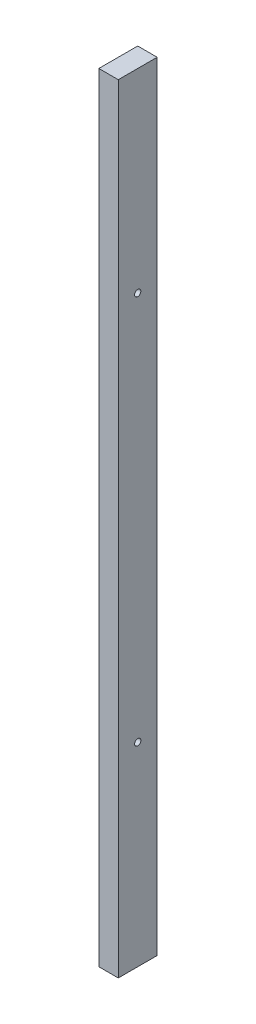
ISO-10303-21;
HEADER;
FILE_DESCRIPTION(('STEP AP214'),'2;1');
FILE_NAME('part.step','',(''),(''),'','','');
FILE_SCHEMA(('AUTOMOTIVE_DESIGN { 1 0 10303 214 1 1 1 1 }'));
ENDSEC;
DATA;
#1=APPLICATION_CONTEXT('core data for automotive mechanical design processes');
#2=APPLICATION_PROTOCOL_DEFINITION('international standard','automotive_design',2000,#1);
#3=PRODUCT_CONTEXT('',#1,'mechanical');
#4=PRODUCT('Part','Part','',(#3));
#5=PRODUCT_RELATED_PRODUCT_CATEGORY('part','',(#4));
#6=PRODUCT_DEFINITION_FORMATION('','',#4);
#7=PRODUCT_DEFINITION_CONTEXT('part definition',#1,'design');
#8=PRODUCT_DEFINITION('design','',#6,#7);
#9=PRODUCT_DEFINITION_SHAPE('','',#8);
#10=(LENGTH_UNIT() NAMED_UNIT(*) SI_UNIT(.MILLI.,.METRE.));
#11=(NAMED_UNIT(*) PLANE_ANGLE_UNIT() SI_UNIT($,.RADIAN.));
#12=(NAMED_UNIT(*) SI_UNIT($,.STERADIAN.) SOLID_ANGLE_UNIT());
#13=UNCERTAINTY_MEASURE_WITH_UNIT(LENGTH_MEASURE(1.E-05),#10,'distance_accuracy_value','');
#14=(GEOMETRIC_REPRESENTATION_CONTEXT(3) GLOBAL_UNCERTAINTY_ASSIGNED_CONTEXT((#13)) GLOBAL_UNIT_ASSIGNED_CONTEXT((#10,
#11,#12)) REPRESENTATION_CONTEXT('',''));
#15=CARTESIAN_POINT('',(0.,0.,0.));
#16=DIRECTION('',(0.,0.,1.));
#17=DIRECTION('',(1.,0.,0.));
#18=AXIS2_PLACEMENT_3D('',#15,#16,#17);
#19=CARTESIAN_POINT('',(-12.5,1000.,-25.));
#20=DIRECTION('',(1.,0.,0.));
#21=DIRECTION('',(0.,0.,-1.));
#22=AXIS2_PLACEMENT_3D('',#19,#20,#21);
#23=PLANE('',#22);
#24=CARTESIAN_POINT('',(-12.5000000000002,250.,0.));
#25=DIRECTION('',(1.,0.,0.));
#26=DIRECTION('',(0.,0.,-1.));
#27=AXIS2_PLACEMENT_3D('',#24,#25,#26);
#28=CIRCLE('',#27,4.);
#29=CARTESIAN_POINT('',(-12.5000000000002,250.,-4.));
#30=VERTEX_POINT('',#29);
#31=EDGE_CURVE('E114',#30,#30,#28,.T.);
#32=ORIENTED_EDGE('',*,*,#31,.T.);
#33=EDGE_LOOP('',(#32));
#34=FACE_BOUND('',#33,.T.);
#35=CARTESIAN_POINT('',(-12.5000000000002,750.,0.));
#36=DIRECTION('',(1.,0.,0.));
#37=DIRECTION('',(0.,0.,-1.));
#38=AXIS2_PLACEMENT_3D('',#35,#36,#37);
#39=CIRCLE('',#38,4.);
#40=CARTESIAN_POINT('',(-12.5000000000002,750.,-4.));
#41=VERTEX_POINT('',#40);
#42=EDGE_CURVE('E134',#41,#41,#39,.T.);
#43=ORIENTED_EDGE('',*,*,#42,.T.);
#44=EDGE_LOOP('',(#43));
#45=FACE_BOUND('',#44,.T.);
#46=DIRECTION('',(0.,0.,1.));
#47=VECTOR('',#46,1.);
#48=CARTESIAN_POINT('',(-12.5,0.,-25.));
#49=LINE('',#48,#47);
#50=CARTESIAN_POINT('',(-12.5,0.,-25.));
#51=VERTEX_POINT('',#50);
#52=CARTESIAN_POINT('',(-12.5,0.,25.));
#53=VERTEX_POINT('',#52);
#54=EDGE_CURVE('E110',#51,#53,#49,.T.);
#55=ORIENTED_EDGE('',*,*,#54,.T.);
#56=DIRECTION('',(0.,-1.,0.));
#57=VECTOR('',#56,1.);
#58=CARTESIAN_POINT('',(-12.5,1000.,25.));
#59=LINE('',#58,#57);
#60=CARTESIAN_POINT('',(-12.5,1000.,25.));
#61=VERTEX_POINT('',#60);
#62=EDGE_CURVE('E11',#61,#53,#59,.T.);
#63=ORIENTED_EDGE('',*,*,#62,.F.);
#64=DIRECTION('',(0.,0.,1.));
#65=VECTOR('',#64,1.);
#66=CARTESIAN_POINT('',(-12.5,1000.,-25.));
#67=LINE('',#66,#65);
#68=CARTESIAN_POINT('',(-12.5,1000.,-25.));
#69=VERTEX_POINT('',#68);
#70=EDGE_CURVE('E94',#69,#61,#67,.T.);
#71=ORIENTED_EDGE('',*,*,#70,.F.);
#72=DIRECTION('',(0.,-1.,0.));
#73=VECTOR('',#72,1.);
#74=CARTESIAN_POINT('',(-12.5,1000.,-25.));
#75=LINE('',#74,#73);
#76=EDGE_CURVE('E106',#69,#51,#75,.T.);
#77=ORIENTED_EDGE('',*,*,#76,.T.);
#78=EDGE_LOOP('',(#55,#63,#71,#77));
#79=FACE_BOUND('',#78,.T.);
#80=ADVANCED_FACE('F42',(#34,#45,#79),#23,.F.);
#81=CARTESIAN_POINT('',(12.5,1000.,25.));
#82=DIRECTION('',(0.,0.,-1.));
#83=DIRECTION('',(-1.,0.,0.));
#84=AXIS2_PLACEMENT_3D('',#81,#82,#83);
#85=PLANE('',#84);
#86=DIRECTION('',(1.,0.,0.));
#87=VECTOR('',#86,1.);
#88=CARTESIAN_POINT('',(12.5,0.,25.));
#89=LINE('',#88,#87);
#90=CARTESIAN_POINT('',(12.5,0.,25.));
#91=VERTEX_POINT('',#90);
#92=EDGE_CURVE('E99',#53,#91,#89,.T.);
#93=ORIENTED_EDGE('',*,*,#92,.T.);
#94=DIRECTION('',(0.,-1.,0.));
#95=VECTOR('',#94,1.);
#96=CARTESIAN_POINT('',(12.5,1000.,25.));
#97=LINE('',#96,#95);
#98=CARTESIAN_POINT('',(12.5,1000.,25.));
#99=VERTEX_POINT('',#98);
#100=EDGE_CURVE('E51',#99,#91,#97,.T.);
#101=ORIENTED_EDGE('',*,*,#100,.F.);
#102=DIRECTION('',(1.,0.,0.));
#103=VECTOR('',#102,1.);
#104=CARTESIAN_POINT('',(12.5,1000.,25.));
#105=LINE('',#104,#103);
#106=EDGE_CURVE('E89',#61,#99,#105,.T.);
#107=ORIENTED_EDGE('',*,*,#106,.F.);
#108=ORIENTED_EDGE('',*,*,#62,.T.);
#109=EDGE_LOOP('',(#93,#101,#107,#108));
#110=FACE_BOUND('',#109,.T.);
#111=ADVANCED_FACE('F98',(#110),#85,.F.);
#112=CARTESIAN_POINT('',(12.5,1000.,-25.));
#113=DIRECTION('',(-1.,0.,0.));
#114=DIRECTION('',(0.,0.,1.));
#115=AXIS2_PLACEMENT_3D('',#112,#113,#114);
#116=PLANE('',#115);
#117=CARTESIAN_POINT('',(12.5,250.,0.));
#118=DIRECTION('',(1.,0.,0.));
#119=DIRECTION('',(0.,0.,-1.));
#120=AXIS2_PLACEMENT_3D('',#117,#118,#119);
#121=CIRCLE('',#120,4.);
#122=CARTESIAN_POINT('',(12.5,250.,-4.));
#123=VERTEX_POINT('',#122);
#124=EDGE_CURVE('E138',#123,#123,#121,.T.);
#125=ORIENTED_EDGE('',*,*,#124,.F.);
#126=EDGE_LOOP('',(#125));
#127=FACE_BOUND('',#126,.T.);
#128=CARTESIAN_POINT('',(12.5,750.,0.));
#129=DIRECTION('',(1.,0.,0.));
#130=DIRECTION('',(0.,0.,-1.));
#131=AXIS2_PLACEMENT_3D('',#128,#129,#130);
#132=CIRCLE('',#131,4.);
#133=CARTESIAN_POINT('',(12.5,750.,-4.));
#134=VERTEX_POINT('',#133);
#135=EDGE_CURVE('E139',#134,#134,#132,.T.);
#136=ORIENTED_EDGE('',*,*,#135,.F.);
#137=EDGE_LOOP('',(#136));
#138=FACE_BOUND('',#137,.T.);
#139=DIRECTION('',(0.,0.,-1.));
#140=VECTOR('',#139,1.);
#141=CARTESIAN_POINT('',(12.5,0.,-25.));
#142=LINE('',#141,#140);
#143=CARTESIAN_POINT('',(12.5,0.,-25.));
#144=VERTEX_POINT('',#143);
#145=EDGE_CURVE('E76',#91,#144,#142,.T.);
#146=ORIENTED_EDGE('',*,*,#145,.T.);
#147=DIRECTION('',(0.,-1.,0.));
#148=VECTOR('',#147,1.);
#149=CARTESIAN_POINT('',(12.5,1000.,-25.));
#150=LINE('',#149,#148);
#151=CARTESIAN_POINT('',(12.5,1000.,-25.));
#152=VERTEX_POINT('',#151);
#153=EDGE_CURVE('E101',#152,#144,#150,.T.);
#154=ORIENTED_EDGE('',*,*,#153,.F.);
#155=DIRECTION('',(0.,0.,-1.));
#156=VECTOR('',#155,1.);
#157=CARTESIAN_POINT('',(12.5,1000.,-25.));
#158=LINE('',#157,#156);
#159=EDGE_CURVE('E92',#99,#152,#158,.T.);
#160=ORIENTED_EDGE('',*,*,#159,.F.);
#161=ORIENTED_EDGE('',*,*,#100,.T.);
#162=EDGE_LOOP('',(#146,#154,#160,#161));
#163=FACE_BOUND('',#162,.T.);
#164=ADVANCED_FACE('F102',(#127,#138,#163),#116,.F.);
#165=CARTESIAN_POINT('',(12.5,1000.,-25.));
#166=DIRECTION('',(0.,0.,1.));
#167=DIRECTION('',(1.,0.,0.));
#168=AXIS2_PLACEMENT_3D('',#165,#166,#167);
#169=PLANE('',#168);
#170=DIRECTION('',(-1.,0.,0.));
#171=VECTOR('',#170,1.);
#172=CARTESIAN_POINT('',(12.5,0.,-25.));
#173=LINE('',#172,#171);
#174=EDGE_CURVE('E82',#144,#51,#173,.T.);
#175=ORIENTED_EDGE('',*,*,#174,.T.);
#176=ORIENTED_EDGE('',*,*,#76,.F.);
#177=DIRECTION('',(-1.,0.,0.));
#178=VECTOR('',#177,1.);
#179=CARTESIAN_POINT('',(12.5,1000.,-25.));
#180=LINE('',#179,#178);
#181=EDGE_CURVE('E59',#152,#69,#180,.T.);
#182=ORIENTED_EDGE('',*,*,#181,.F.);
#183=ORIENTED_EDGE('',*,*,#153,.T.);
#184=EDGE_LOOP('',(#175,#176,#182,#183));
#185=FACE_BOUND('',#184,.T.);
#186=ADVANCED_FACE('F124',(#185),#169,.F.);
#187=CARTESIAN_POINT('',(0.,1000.,0.));
#188=DIRECTION('',(0.,-1.,0.));
#189=DIRECTION('',(0.,0.,-1.));
#190=AXIS2_PLACEMENT_3D('',#187,#188,#189);
#191=PLANE('',#190);
#192=ORIENTED_EDGE('',*,*,#70,.T.);
#193=ORIENTED_EDGE('',*,*,#106,.T.);
#194=ORIENTED_EDGE('',*,*,#159,.T.);
#195=ORIENTED_EDGE('',*,*,#181,.T.);
#196=EDGE_LOOP('',(#192,#193,#194,#195));
#197=FACE_BOUND('',#196,.T.);
#198=ADVANCED_FACE('F90',(#197),#191,.F.);
#199=CARTESIAN_POINT('',(0.,0.,0.));
#200=DIRECTION('',(0.,-1.,0.));
#201=DIRECTION('',(0.,0.,-1.));
#202=AXIS2_PLACEMENT_3D('',#199,#200,#201);
#203=PLANE('',#202);
#204=ORIENTED_EDGE('',*,*,#54,.F.);
#205=ORIENTED_EDGE('',*,*,#174,.F.);
#206=ORIENTED_EDGE('',*,*,#145,.F.);
#207=ORIENTED_EDGE('',*,*,#92,.F.);
#208=EDGE_LOOP('',(#204,#205,#206,#207));
#209=FACE_BOUND('',#208,.T.);
#210=ADVANCED_FACE('F127',(#209),#203,.T.);
#211=CARTESIAN_POINT('',(-2201.65898255,750.,0.));
#212=DIRECTION('',(1.,0.,0.));
#213=DIRECTION('',(0.,0.,-1.));
#214=AXIS2_PLACEMENT_3D('',#211,#212,#213);
#215=CYLINDRICAL_SURFACE('',#214,4.);
#216=ORIENTED_EDGE('',*,*,#135,.T.);
#217=EDGE_LOOP('',(#216));
#218=FACE_BOUND('',#217,.T.);
#219=ORIENTED_EDGE('',*,*,#42,.F.);
#220=EDGE_LOOP('',(#219));
#221=FACE_BOUND('',#220,.T.);
#222=ADVANCED_FACE('F155',(#218,#221),#215,.F.);
#223=CARTESIAN_POINT('',(-2201.65898255,250.,0.));
#224=DIRECTION('',(1.,0.,0.));
#225=DIRECTION('',(0.,0.,-1.));
#226=AXIS2_PLACEMENT_3D('',#223,#224,#225);
#227=CYLINDRICAL_SURFACE('',#226,4.);
#228=ORIENTED_EDGE('',*,*,#124,.T.);
#229=EDGE_LOOP('',(#228));
#230=FACE_BOUND('',#229,.T.);
#231=ORIENTED_EDGE('',*,*,#31,.F.);
#232=EDGE_LOOP('',(#231));
#233=FACE_BOUND('',#232,.T.);
#234=ADVANCED_FACE('F147',(#230,#233),#227,.F.);
#235=CLOSED_SHELL('',(#80,#111,#164,#186,#198,#210,#222,#234));
#236=MANIFOLD_SOLID_BREP('B2',#235);
#237=ADVANCED_BREP_SHAPE_REPRESENTATION('',(#18,#236),#14);
#238=SHAPE_DEFINITION_REPRESENTATION(#9,#237);
ENDSEC;
END-ISO-10303-21;
